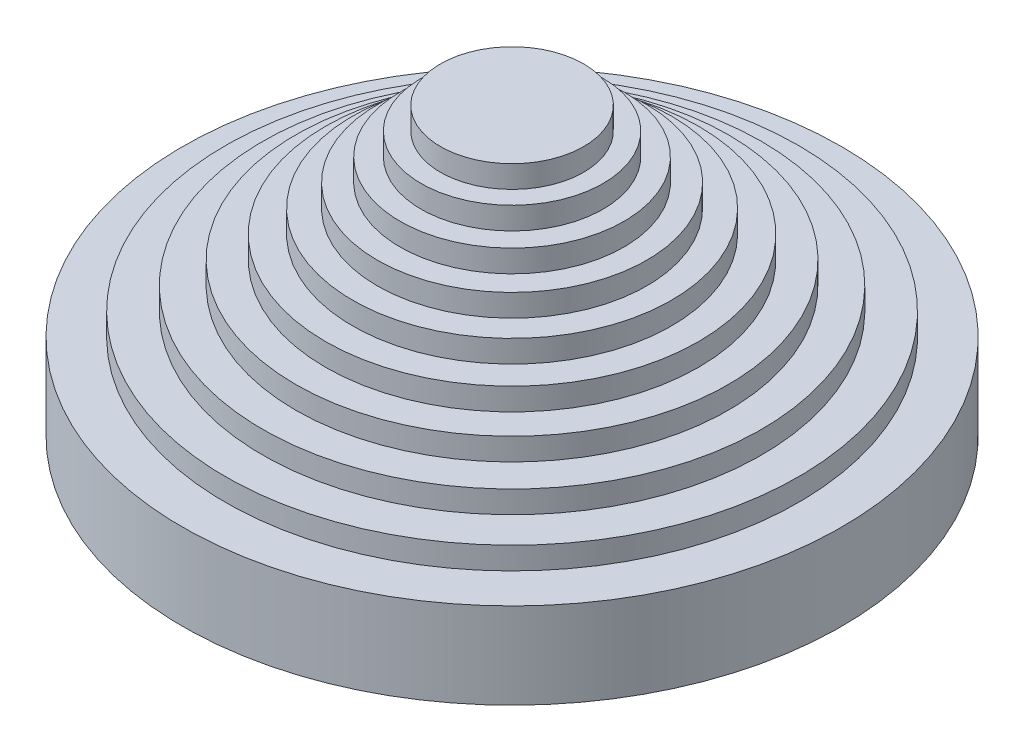
ISO-10303-21;
HEADER;
FILE_DESCRIPTION(('STEP AP214'),'2;1');
FILE_NAME('part.step','',(''),(''),'','','');
FILE_SCHEMA(('AUTOMOTIVE_DESIGN { 1 0 10303 214 1 1 1 1 }'));
ENDSEC;
DATA;
#1=APPLICATION_CONTEXT('core data for automotive mechanical design processes');
#2=APPLICATION_PROTOCOL_DEFINITION('international standard','automotive_design',2000,#1);
#3=PRODUCT_CONTEXT('',#1,'mechanical');
#4=PRODUCT('Part','Part','',(#3));
#5=PRODUCT_RELATED_PRODUCT_CATEGORY('part','',(#4));
#6=PRODUCT_DEFINITION_FORMATION('','',#4);
#7=PRODUCT_DEFINITION_CONTEXT('part definition',#1,'design');
#8=PRODUCT_DEFINITION('design','',#6,#7);
#9=PRODUCT_DEFINITION_SHAPE('','',#8);
#10=(LENGTH_UNIT() NAMED_UNIT(*) SI_UNIT(.MILLI.,.METRE.));
#11=(NAMED_UNIT(*) PLANE_ANGLE_UNIT() SI_UNIT($,.RADIAN.));
#12=(NAMED_UNIT(*) SI_UNIT($,.STERADIAN.) SOLID_ANGLE_UNIT());
#13=UNCERTAINTY_MEASURE_WITH_UNIT(LENGTH_MEASURE(1.E-05),#10,'distance_accuracy_value','');
#14=(GEOMETRIC_REPRESENTATION_CONTEXT(3) GLOBAL_UNCERTAINTY_ASSIGNED_CONTEXT((#13)) GLOBAL_UNIT_ASSIGNED_CONTEXT((#10,
#11,#12)) REPRESENTATION_CONTEXT('',''));
#15=CARTESIAN_POINT('',(0.,0.,0.));
#16=DIRECTION('',(0.,0.,1.));
#17=DIRECTION('',(1.,0.,0.));
#18=AXIS2_PLACEMENT_3D('',#15,#16,#17);
#19=CARTESIAN_POINT('',(0.,0.,11.5));
#20=DIRECTION('',(0.,1.,0.));
#21=DIRECTION('',(0.,0.,1.));
#22=AXIS2_PLACEMENT_3D('',#19,#20,#21);
#23=PLANE('',#22);
#24=CARTESIAN_POINT('',(0.,0.,0.));
#25=DIRECTION('',(0.,-1.,0.));
#26=DIRECTION('',(0.,0.,-1.));
#27=AXIS2_PLACEMENT_3D('',#24,#25,#26);
#28=CIRCLE('',#27,3.2);
#29=CARTESIAN_POINT('',(0.,0.,-3.2));
#30=VERTEX_POINT('',#29);
#31=EDGE_CURVE('E75',#30,#30,#28,.T.);
#32=ORIENTED_EDGE('',*,*,#31,.F.);
#33=EDGE_LOOP('',(#32));
#34=FACE_BOUND('',#33,.T.);
#35=CARTESIAN_POINT('',(0.,0.,0.));
#36=DIRECTION('',(0.,-1.,0.));
#37=DIRECTION('',(0.,0.,-1.));
#38=AXIS2_PLACEMENT_3D('',#35,#36,#37);
#39=CIRCLE('',#38,11.5);
#40=CARTESIAN_POINT('',(0.,0.,-11.5));
#41=VERTEX_POINT('',#40);
#42=EDGE_CURVE('E78',#41,#41,#39,.T.);
#43=ORIENTED_EDGE('',*,*,#42,.T.);
#44=EDGE_LOOP('',(#43));
#45=FACE_BOUND('',#44,.T.);
#46=ADVANCED_FACE('F32',(#34,#45),#23,.F.);
#47=CARTESIAN_POINT('',(0.,0.,0.));
#48=DIRECTION('',(0.,-1.,0.));
#49=DIRECTION('',(0.,0.,-1.));
#50=AXIS2_PLACEMENT_3D('',#47,#48,#49);
#51=CYLINDRICAL_SURFACE('',#50,11.5);
#52=ORIENTED_EDGE('',*,*,#42,.F.);
#53=EDGE_LOOP('',(#52));
#54=FACE_BOUND('',#53,.T.);
#55=CARTESIAN_POINT('',(0.,3.,0.));
#56=DIRECTION('',(0.,-1.,0.));
#57=DIRECTION('',(0.,0.,-1.));
#58=AXIS2_PLACEMENT_3D('',#55,#56,#57);
#59=CIRCLE('',#58,11.5);
#60=CARTESIAN_POINT('',(0.,3.,-11.5));
#61=VERTEX_POINT('',#60);
#62=EDGE_CURVE('E132',#61,#61,#59,.T.);
#63=ORIENTED_EDGE('',*,*,#62,.T.);
#64=EDGE_LOOP('',(#63));
#65=FACE_BOUND('',#64,.T.);
#66=ADVANCED_FACE('F152',(#54,#65),#51,.T.);
#67=CARTESIAN_POINT('',(0.,3.,11.5));
#68=DIRECTION('',(0.,-1.,0.));
#69=DIRECTION('',(0.,0.,-1.));
#70=AXIS2_PLACEMENT_3D('',#67,#68,#69);
#71=PLANE('',#70);
#72=ORIENTED_EDGE('',*,*,#62,.F.);
#73=EDGE_LOOP('',(#72));
#74=FACE_BOUND('',#73,.T.);
#75=CARTESIAN_POINT('',(0.,3.,0.));
#76=DIRECTION('',(0.,-1.,0.));
#77=DIRECTION('',(0.,0.,-1.));
#78=AXIS2_PLACEMENT_3D('',#75,#76,#77);
#79=CIRCLE('',#78,10.0042868103528);
#80=CARTESIAN_POINT('',(0.,3.,-10.0042868103528));
#81=VERTEX_POINT('',#80);
#82=EDGE_CURVE('E129',#81,#81,#79,.T.);
#83=ORIENTED_EDGE('',*,*,#82,.T.);
#84=EDGE_LOOP('',(#83));
#85=FACE_BOUND('',#84,.T.);
#86=ADVANCED_FACE('F157',(#74,#85),#71,.F.);
#87=CARTESIAN_POINT('',(0.,0.,0.));
#88=DIRECTION('',(0.,-1.,0.));
#89=DIRECTION('',(0.,0.,-1.));
#90=AXIS2_PLACEMENT_3D('',#87,#88,#89);
#91=CYLINDRICAL_SURFACE('',#90,10.0042868103528);
#92=ORIENTED_EDGE('',*,*,#82,.F.);
#93=EDGE_LOOP('',(#92));
#94=FACE_BOUND('',#93,.T.);
#95=CARTESIAN_POINT('',(0.,3.77777777777778,0.));
#96=DIRECTION('',(0.,-1.,0.));
#97=DIRECTION('',(0.,0.,-1.));
#98=AXIS2_PLACEMENT_3D('',#95,#96,#97);
#99=CIRCLE('',#98,10.0042868103528);
#100=CARTESIAN_POINT('',(0.,3.77777777777778,-10.0042868103528));
#101=VERTEX_POINT('',#100);
#102=EDGE_CURVE('E126',#101,#101,#99,.T.);
#103=ORIENTED_EDGE('',*,*,#102,.T.);
#104=EDGE_LOOP('',(#103));
#105=FACE_BOUND('',#104,.T.);
#106=ADVANCED_FACE('F162',(#94,#105),#91,.T.);
#107=CARTESIAN_POINT('',(0.,3.77777777777778,10.0042868103528));
#108=DIRECTION('',(0.,-1.,0.));
#109=DIRECTION('',(0.,0.,-1.));
#110=AXIS2_PLACEMENT_3D('',#107,#108,#109);
#111=PLANE('',#110);
#112=ORIENTED_EDGE('',*,*,#102,.F.);
#113=EDGE_LOOP('',(#112));
#114=FACE_BOUND('',#113,.T.);
#115=CARTESIAN_POINT('',(0.,3.77777777777778,0.));
#116=DIRECTION('',(0.,-1.,0.));
#117=DIRECTION('',(0.,0.,-1.));
#118=AXIS2_PLACEMENT_3D('',#115,#116,#117);
#119=CIRCLE('',#118,8.70328101729719);
#120=CARTESIAN_POINT('',(0.,3.77777777777778,-8.70328101729719));
#121=VERTEX_POINT('',#120);
#122=EDGE_CURVE('E123',#121,#121,#119,.T.);
#123=ORIENTED_EDGE('',*,*,#122,.T.);
#124=EDGE_LOOP('',(#123));
#125=FACE_BOUND('',#124,.T.);
#126=ADVANCED_FACE('F168',(#114,#125),#111,.F.);
#127=CARTESIAN_POINT('',(0.,0.,0.));
#128=DIRECTION('',(0.,-1.,0.));
#129=DIRECTION('',(0.,0.,-1.));
#130=AXIS2_PLACEMENT_3D('',#127,#128,#129);
#131=CYLINDRICAL_SURFACE('',#130,8.70328101729719);
#132=ORIENTED_EDGE('',*,*,#122,.F.);
#133=EDGE_LOOP('',(#132));
#134=FACE_BOUND('',#133,.T.);
#135=CARTESIAN_POINT('',(0.,4.55555555555555,0.));
#136=DIRECTION('',(0.,-1.,0.));
#137=DIRECTION('',(0.,0.,-1.));
#138=AXIS2_PLACEMENT_3D('',#135,#136,#137);
#139=CIRCLE('',#138,8.70328101729719);
#140=CARTESIAN_POINT('',(0.,4.55555555555555,-8.70328101729719));
#141=VERTEX_POINT('',#140);
#142=EDGE_CURVE('E120',#141,#141,#139,.T.);
#143=ORIENTED_EDGE('',*,*,#142,.T.);
#144=EDGE_LOOP('',(#143));
#145=FACE_BOUND('',#144,.T.);
#146=ADVANCED_FACE('F174',(#134,#145),#131,.T.);
#147=CARTESIAN_POINT('',(0.,4.55555555555556,8.70328101729719));
#148=DIRECTION('',(0.,-1.,0.));
#149=DIRECTION('',(0.,0.,-1.));
#150=AXIS2_PLACEMENT_3D('',#147,#148,#149);
#151=PLANE('',#150);
#152=ORIENTED_EDGE('',*,*,#142,.F.);
#153=EDGE_LOOP('',(#152));
#154=FACE_BOUND('',#153,.T.);
#155=CARTESIAN_POINT('',(0.,4.55555555555556,0.));
#156=DIRECTION('',(0.,-1.,0.));
#157=DIRECTION('',(0.,0.,-1.));
#158=AXIS2_PLACEMENT_3D('',#155,#156,#157);
#159=CIRCLE('',#158,7.548361645505);
#160=CARTESIAN_POINT('',(0.,4.55555555555556,-7.548361645505));
#161=VERTEX_POINT('',#160);
#162=EDGE_CURVE('E117',#161,#161,#159,.T.);
#163=ORIENTED_EDGE('',*,*,#162,.T.);
#164=EDGE_LOOP('',(#163));
#165=FACE_BOUND('',#164,.T.);
#166=ADVANCED_FACE('F180',(#154,#165),#151,.F.);
#167=CARTESIAN_POINT('',(0.,0.,0.));
#168=DIRECTION('',(0.,-1.,0.));
#169=DIRECTION('',(0.,0.,-1.));
#170=AXIS2_PLACEMENT_3D('',#167,#168,#169);
#171=CYLINDRICAL_SURFACE('',#170,7.548361645505);
#172=ORIENTED_EDGE('',*,*,#162,.F.);
#173=EDGE_LOOP('',(#172));
#174=FACE_BOUND('',#173,.T.);
#175=CARTESIAN_POINT('',(0.,5.33333333333334,0.));
#176=DIRECTION('',(0.,-1.,0.));
#177=DIRECTION('',(0.,0.,-1.));
#178=AXIS2_PLACEMENT_3D('',#175,#176,#177);
#179=CIRCLE('',#178,7.548361645505);
#180=CARTESIAN_POINT('',(0.,5.33333333333334,-7.548361645505));
#181=VERTEX_POINT('',#180);
#182=EDGE_CURVE('E114',#181,#181,#179,.T.);
#183=ORIENTED_EDGE('',*,*,#182,.T.);
#184=EDGE_LOOP('',(#183));
#185=FACE_BOUND('',#184,.T.);
#186=ADVANCED_FACE('F186',(#174,#185),#171,.T.);
#187=CARTESIAN_POINT('',(0.,5.33333333333333,7.548361645505));
#188=DIRECTION('',(0.,-1.,0.));
#189=DIRECTION('',(0.,0.,-1.));
#190=AXIS2_PLACEMENT_3D('',#187,#188,#189);
#191=PLANE('',#190);
#192=ORIENTED_EDGE('',*,*,#182,.F.);
#193=EDGE_LOOP('',(#192));
#194=FACE_BOUND('',#193,.T.);
#195=CARTESIAN_POINT('',(0.,5.33333333333333,0.));
#196=DIRECTION('',(0.,-1.,0.));
#197=DIRECTION('',(0.,0.,-1.));
#198=AXIS2_PLACEMENT_3D('',#195,#196,#197);
#199=CIRCLE('',#198,6.50918068187569);
#200=CARTESIAN_POINT('',(0.,5.33333333333333,-6.50918068187569));
#201=VERTEX_POINT('',#200);
#202=EDGE_CURVE('E111',#201,#201,#199,.T.);
#203=ORIENTED_EDGE('',*,*,#202,.T.);
#204=EDGE_LOOP('',(#203));
#205=FACE_BOUND('',#204,.T.);
#206=ADVANCED_FACE('F192',(#194,#205),#191,.F.);
#207=CARTESIAN_POINT('',(0.,0.,0.));
#208=DIRECTION('',(0.,-1.,0.));
#209=DIRECTION('',(0.,0.,-1.));
#210=AXIS2_PLACEMENT_3D('',#207,#208,#209);
#211=CYLINDRICAL_SURFACE('',#210,6.50918068187569);
#212=ORIENTED_EDGE('',*,*,#202,.F.);
#213=EDGE_LOOP('',(#212));
#214=FACE_BOUND('',#213,.T.);
#215=CARTESIAN_POINT('',(0.,6.11111111111111,0.));
#216=DIRECTION('',(0.,-1.,0.));
#217=DIRECTION('',(0.,0.,-1.));
#218=AXIS2_PLACEMENT_3D('',#215,#216,#217);
#219=CIRCLE('',#218,6.50918068187569);
#220=CARTESIAN_POINT('',(0.,6.11111111111111,-6.50918068187569));
#221=VERTEX_POINT('',#220);
#222=EDGE_CURVE('E108',#221,#221,#219,.T.);
#223=ORIENTED_EDGE('',*,*,#222,.T.);
#224=EDGE_LOOP('',(#223));
#225=FACE_BOUND('',#224,.T.);
#226=ADVANCED_FACE('F198',(#214,#225),#211,.T.);
#227=CARTESIAN_POINT('',(0.,6.11111111111111,6.50918068187569));
#228=DIRECTION('',(0.,-1.,0.));
#229=DIRECTION('',(0.,0.,-1.));
#230=AXIS2_PLACEMENT_3D('',#227,#228,#229);
#231=PLANE('',#230);
#232=ORIENTED_EDGE('',*,*,#222,.F.);
#233=EDGE_LOOP('',(#232));
#234=FACE_BOUND('',#233,.T.);
#235=CARTESIAN_POINT('',(0.,6.11111111111111,0.));
#236=DIRECTION('',(0.,-1.,0.));
#237=DIRECTION('',(0.,0.,-1.));
#238=AXIS2_PLACEMENT_3D('',#235,#236,#237);
#239=CIRCLE('',#238,5.56526863170023);
#240=CARTESIAN_POINT('',(0.,6.11111111111111,-5.56526863170023));
#241=VERTEX_POINT('',#240);
#242=EDGE_CURVE('E105',#241,#241,#239,.T.);
#243=ORIENTED_EDGE('',*,*,#242,.T.);
#244=EDGE_LOOP('',(#243));
#245=FACE_BOUND('',#244,.T.);
#246=ADVANCED_FACE('F204',(#234,#245),#231,.F.);
#247=CARTESIAN_POINT('',(0.,0.,0.));
#248=DIRECTION('',(0.,-1.,0.));
#249=DIRECTION('',(0.,0.,-1.));
#250=AXIS2_PLACEMENT_3D('',#247,#248,#249);
#251=CYLINDRICAL_SURFACE('',#250,5.56526863170023);
#252=ORIENTED_EDGE('',*,*,#242,.F.);
#253=EDGE_LOOP('',(#252));
#254=FACE_BOUND('',#253,.T.);
#255=CARTESIAN_POINT('',(0.,6.88888888888889,0.));
#256=DIRECTION('',(0.,-1.,0.));
#257=DIRECTION('',(0.,0.,-1.));
#258=AXIS2_PLACEMENT_3D('',#255,#256,#257);
#259=CIRCLE('',#258,5.56526863170023);
#260=CARTESIAN_POINT('',(0.,6.88888888888889,-5.56526863170023));
#261=VERTEX_POINT('',#260);
#262=EDGE_CURVE('E102',#261,#261,#259,.T.);
#263=ORIENTED_EDGE('',*,*,#262,.T.);
#264=EDGE_LOOP('',(#263));
#265=FACE_BOUND('',#264,.T.);
#266=ADVANCED_FACE('F210',(#254,#265),#251,.T.);
#267=CARTESIAN_POINT('',(0.,6.88888888888889,5.56526863170023));
#268=DIRECTION('',(0.,-1.,0.));
#269=DIRECTION('',(0.,0.,-1.));
#270=AXIS2_PLACEMENT_3D('',#267,#268,#269);
#271=PLANE('',#270);
#272=ORIENTED_EDGE('',*,*,#262,.F.);
#273=EDGE_LOOP('',(#272));
#274=FACE_BOUND('',#273,.T.);
#275=CARTESIAN_POINT('',(0.,6.88888888888889,0.));
#276=DIRECTION('',(0.,-1.,0.));
#277=DIRECTION('',(0.,0.,-1.));
#278=AXIS2_PLACEMENT_3D('',#275,#276,#277);
#279=CIRCLE('',#278,4.70203774251105);
#280=CARTESIAN_POINT('',(0.,6.88888888888889,-4.70203774251105));
#281=VERTEX_POINT('',#280);
#282=EDGE_CURVE('E99',#281,#281,#279,.T.);
#283=ORIENTED_EDGE('',*,*,#282,.T.);
#284=EDGE_LOOP('',(#283));
#285=FACE_BOUND('',#284,.T.);
#286=ADVANCED_FACE('F216',(#274,#285),#271,.F.);
#287=CARTESIAN_POINT('',(0.,0.,0.));
#288=DIRECTION('',(0.,-1.,0.));
#289=DIRECTION('',(0.,0.,-1.));
#290=AXIS2_PLACEMENT_3D('',#287,#288,#289);
#291=CYLINDRICAL_SURFACE('',#290,4.70203774251105);
#292=ORIENTED_EDGE('',*,*,#282,.F.);
#293=EDGE_LOOP('',(#292));
#294=FACE_BOUND('',#293,.T.);
#295=CARTESIAN_POINT('',(0.,7.66666666666667,0.));
#296=DIRECTION('',(0.,-1.,0.));
#297=DIRECTION('',(0.,0.,-1.));
#298=AXIS2_PLACEMENT_3D('',#295,#296,#297);
#299=CIRCLE('',#298,4.70203774251105);
#300=CARTESIAN_POINT('',(0.,7.66666666666667,-4.70203774251105));
#301=VERTEX_POINT('',#300);
#302=EDGE_CURVE('E96',#301,#301,#299,.T.);
#303=ORIENTED_EDGE('',*,*,#302,.T.);
#304=EDGE_LOOP('',(#303));
#305=FACE_BOUND('',#304,.T.);
#306=ADVANCED_FACE('F222',(#294,#305),#291,.T.);
#307=CARTESIAN_POINT('',(0.,7.66666666666667,4.70203774251105));
#308=DIRECTION('',(0.,-1.,0.));
#309=DIRECTION('',(0.,0.,-1.));
#310=AXIS2_PLACEMENT_3D('',#307,#308,#309);
#311=PLANE('',#310);
#312=ORIENTED_EDGE('',*,*,#302,.F.);
#313=EDGE_LOOP('',(#312));
#314=FACE_BOUND('',#313,.T.);
#315=CARTESIAN_POINT('',(0.,7.66666666666667,0.));
#316=DIRECTION('',(0.,-1.,0.));
#317=DIRECTION('',(0.,0.,-1.));
#318=AXIS2_PLACEMENT_3D('',#315,#316,#317);
#319=CIRCLE('',#318,3.90865574576532);
#320=CARTESIAN_POINT('',(0.,7.66666666666667,-3.90865574576532));
#321=VERTEX_POINT('',#320);
#322=EDGE_CURVE('E93',#321,#321,#319,.T.);
#323=ORIENTED_EDGE('',*,*,#322,.T.);
#324=EDGE_LOOP('',(#323));
#325=FACE_BOUND('',#324,.T.);
#326=ADVANCED_FACE('F228',(#314,#325),#311,.F.);
#327=CARTESIAN_POINT('',(0.,0.,0.));
#328=DIRECTION('',(0.,-1.,0.));
#329=DIRECTION('',(0.,0.,-1.));
#330=AXIS2_PLACEMENT_3D('',#327,#328,#329);
#331=CYLINDRICAL_SURFACE('',#330,3.90865574576532);
#332=ORIENTED_EDGE('',*,*,#322,.F.);
#333=EDGE_LOOP('',(#332));
#334=FACE_BOUND('',#333,.T.);
#335=CARTESIAN_POINT('',(0.,8.44444444444444,0.));
#336=DIRECTION('',(0.,-1.,0.));
#337=DIRECTION('',(0.,0.,-1.));
#338=AXIS2_PLACEMENT_3D('',#335,#336,#337);
#339=CIRCLE('',#338,3.90865574576532);
#340=CARTESIAN_POINT('',(0.,8.44444444444444,-3.90865574576532));
#341=VERTEX_POINT('',#340);
#342=EDGE_CURVE('E90',#341,#341,#339,.T.);
#343=ORIENTED_EDGE('',*,*,#342,.T.);
#344=EDGE_LOOP('',(#343));
#345=FACE_BOUND('',#344,.T.);
#346=ADVANCED_FACE('F234',(#334,#345),#331,.T.);
#347=CARTESIAN_POINT('',(0.,8.44444444444445,3.90865574576532));
#348=DIRECTION('',(0.,-1.,0.));
#349=DIRECTION('',(0.,0.,-1.));
#350=AXIS2_PLACEMENT_3D('',#347,#348,#349);
#351=PLANE('',#350);
#352=ORIENTED_EDGE('',*,*,#342,.F.);
#353=EDGE_LOOP('',(#352));
#354=FACE_BOUND('',#353,.T.);
#355=CARTESIAN_POINT('',(0.,8.44444444444445,0.));
#356=DIRECTION('',(0.,-1.,0.));
#357=DIRECTION('',(0.,0.,-1.));
#358=AXIS2_PLACEMENT_3D('',#355,#356,#357);
#359=CIRCLE('',#358,3.17681912757138);
#360=CARTESIAN_POINT('',(0.,8.44444444444445,-3.17681912757138));
#361=VERTEX_POINT('',#360);
#362=EDGE_CURVE('E87',#361,#361,#359,.T.);
#363=ORIENTED_EDGE('',*,*,#362,.T.);
#364=EDGE_LOOP('',(#363));
#365=FACE_BOUND('',#364,.T.);
#366=ADVANCED_FACE('F240',(#354,#365),#351,.F.);
#367=CARTESIAN_POINT('',(0.,0.,0.));
#368=DIRECTION('',(0.,-1.,0.));
#369=DIRECTION('',(0.,0.,-1.));
#370=AXIS2_PLACEMENT_3D('',#367,#368,#369);
#371=CYLINDRICAL_SURFACE('',#370,3.17681912757138);
#372=ORIENTED_EDGE('',*,*,#362,.F.);
#373=EDGE_LOOP('',(#372));
#374=FACE_BOUND('',#373,.T.);
#375=CARTESIAN_POINT('',(0.,9.22222222222223,0.));
#376=DIRECTION('',(0.,-1.,0.));
#377=DIRECTION('',(0.,0.,-1.));
#378=AXIS2_PLACEMENT_3D('',#375,#376,#377);
#379=CIRCLE('',#378,3.17681912757138);
#380=CARTESIAN_POINT('',(0.,9.22222222222223,-3.17681912757138));
#381=VERTEX_POINT('',#380);
#382=EDGE_CURVE('E84',#381,#381,#379,.T.);
#383=ORIENTED_EDGE('',*,*,#382,.T.);
#384=EDGE_LOOP('',(#383));
#385=FACE_BOUND('',#384,.T.);
#386=ADVANCED_FACE('F246',(#374,#385),#371,.T.);
#387=CARTESIAN_POINT('',(0.,9.22222222222222,3.17681912757138));
#388=DIRECTION('',(0.,-1.,0.));
#389=DIRECTION('',(0.,0.,-1.));
#390=AXIS2_PLACEMENT_3D('',#387,#388,#389);
#391=PLANE('',#390);
#392=ORIENTED_EDGE('',*,*,#382,.F.);
#393=EDGE_LOOP('',(#392));
#394=FACE_BOUND('',#393,.T.);
#395=CARTESIAN_POINT('',(0.,9.22222222222222,0.));
#396=DIRECTION('',(0.,-1.,0.));
#397=DIRECTION('',(0.,0.,-1.));
#398=AXIS2_PLACEMENT_3D('',#395,#396,#397);
#399=CIRCLE('',#398,2.50000000000001);
#400=CARTESIAN_POINT('',(0.,9.22222222222222,-2.50000000000001));
#401=VERTEX_POINT('',#400);
#402=EDGE_CURVE('E81',#401,#401,#399,.T.);
#403=ORIENTED_EDGE('',*,*,#402,.T.);
#404=EDGE_LOOP('',(#403));
#405=FACE_BOUND('',#404,.T.);
#406=ADVANCED_FACE('F252',(#394,#405),#391,.F.);
#407=CARTESIAN_POINT('',(0.,0.,0.));
#408=DIRECTION('',(0.,-1.,0.));
#409=DIRECTION('',(0.,0.,-1.));
#410=AXIS2_PLACEMENT_3D('',#407,#408,#409);
#411=CYLINDRICAL_SURFACE('',#410,2.50000000000001);
#412=ORIENTED_EDGE('',*,*,#402,.F.);
#413=EDGE_LOOP('',(#412));
#414=FACE_BOUND('',#413,.T.);
#415=CARTESIAN_POINT('',(0.,10.,0.));
#416=DIRECTION('',(0.,-1.,0.));
#417=DIRECTION('',(0.,0.,-1.));
#418=AXIS2_PLACEMENT_3D('',#415,#416,#417);
#419=CIRCLE('',#418,2.50000000000001);
#420=CARTESIAN_POINT('',(0.,10.,-2.50000000000001));
#421=VERTEX_POINT('',#420);
#422=EDGE_CURVE('E74',#421,#421,#419,.T.);
#423=ORIENTED_EDGE('',*,*,#422,.T.);
#424=EDGE_LOOP('',(#423));
#425=FACE_BOUND('',#424,.T.);
#426=ADVANCED_FACE('F258',(#414,#425),#411,.T.);
#427=CARTESIAN_POINT('',(0.,10.,2.50000000000001));
#428=DIRECTION('',(0.,-1.,0.));
#429=DIRECTION('',(0.,0.,-1.));
#430=AXIS2_PLACEMENT_3D('',#427,#428,#429);
#431=PLANE('',#430);
#432=ORIENTED_EDGE('',*,*,#422,.F.);
#433=EDGE_LOOP('',(#432));
#434=FACE_BOUND('',#433,.T.);
#435=ADVANCED_FACE('F146',(#434),#431,.F.);
#436=CARTESIAN_POINT('',(0.,-2.6,0.));
#437=DIRECTION('',(0.,1.,0.));
#438=DIRECTION('',(0.,0.,1.));
#439=AXIS2_PLACEMENT_3D('',#436,#437,#438);
#440=CYLINDRICAL_SURFACE('',#439,3.2);
#441=CARTESIAN_POINT('',(0.,-2.6,0.));
#442=DIRECTION('',(0.,-1.,0.));
#443=DIRECTION('',(0.,0.,-1.));
#444=AXIS2_PLACEMENT_3D('',#441,#442,#443);
#445=CIRCLE('',#444,3.2);
#446=CARTESIAN_POINT('',(0.,-2.6,-3.2));
#447=VERTEX_POINT('',#446);
#448=EDGE_CURVE('E70',#447,#447,#445,.T.);
#449=ORIENTED_EDGE('',*,*,#448,.F.);
#450=EDGE_LOOP('',(#449));
#451=FACE_BOUND('',#450,.T.);
#452=ORIENTED_EDGE('',*,*,#31,.T.);
#453=EDGE_LOOP('',(#452));
#454=FACE_BOUND('',#453,.T.);
#455=ADVANCED_FACE('F140',(#451,#454),#440,.T.);
#456=CARTESIAN_POINT('',(0.,-2.6,0.));
#457=DIRECTION('',(0.,-1.,0.));
#458=DIRECTION('',(0.,0.,-1.));
#459=AXIS2_PLACEMENT_3D('',#456,#457,#458);
#460=PLANE('',#459);
#461=CARTESIAN_POINT('',(0.,-2.6,0.));
#462=DIRECTION('',(0.,-1.,0.));
#463=DIRECTION('',(0.,0.,-1.));
#464=AXIS2_PLACEMENT_3D('',#461,#462,#463);
#465=CIRCLE('',#464,2.05);
#466=CARTESIAN_POINT('',(-1.44913767461894,-2.6,1.45));
#467=VERTEX_POINT('',#466);
#468=CARTESIAN_POINT('',(1.44913767461894,-2.6,1.45));
#469=VERTEX_POINT('',#468);
#470=EDGE_CURVE('E11',#467,#469,#465,.T.);
#471=ORIENTED_EDGE('',*,*,#470,.F.);
#472=DIRECTION('',(1.,0.,0.));
#473=VECTOR('',#472,1.);
#474=CARTESIAN_POINT('',(0.,-2.6,1.45));
#475=LINE('',#474,#473);
#476=EDGE_CURVE('E39',#467,#469,#475,.T.);
#477=ORIENTED_EDGE('',*,*,#476,.T.);
#478=EDGE_LOOP('',(#471,#477));
#479=FACE_BOUND('',#478,.T.);
#480=ORIENTED_EDGE('',*,*,#448,.T.);
#481=EDGE_LOOP('',(#480));
#482=FACE_BOUND('',#481,.T.);
#483=ADVANCED_FACE('F137',(#479,#482),#460,.T.);
#484=CARTESIAN_POINT('',(0.,3.,0.));
#485=DIRECTION('',(0.,-1.,0.));
#486=DIRECTION('',(0.,0.,-1.));
#487=AXIS2_PLACEMENT_3D('',#484,#485,#486);
#488=CYLINDRICAL_SURFACE('',#487,2.05);
#489=ORIENTED_EDGE('',*,*,#470,.T.);
#490=DIRECTION('',(0.,-1.,0.));
#491=VECTOR('',#490,1.);
#492=CARTESIAN_POINT('',(1.44913767461894,3.,1.45));
#493=LINE('',#492,#491);
#494=CARTESIAN_POINT('',(1.44913767461894,3.,1.45));
#495=VERTEX_POINT('',#494);
#496=EDGE_CURVE('E46',#495,#469,#493,.T.);
#497=ORIENTED_EDGE('',*,*,#496,.F.);
#498=CARTESIAN_POINT('',(0.,3.,0.));
#499=DIRECTION('',(0.,-1.,0.));
#500=DIRECTION('',(0.,0.,-1.));
#501=AXIS2_PLACEMENT_3D('',#498,#499,#500);
#502=CIRCLE('',#501,2.05);
#503=CARTESIAN_POINT('',(-1.44913767461894,3.,1.45));
#504=VERTEX_POINT('',#503);
#505=EDGE_CURVE('E61',#504,#495,#502,.T.);
#506=ORIENTED_EDGE('',*,*,#505,.F.);
#507=DIRECTION('',(0.,-1.,0.));
#508=VECTOR('',#507,1.);
#509=CARTESIAN_POINT('',(-1.44913767461894,3.,1.45));
#510=LINE('',#509,#508);
#511=EDGE_CURVE('E57',#504,#467,#510,.T.);
#512=ORIENTED_EDGE('',*,*,#511,.T.);
#513=EDGE_LOOP('',(#489,#497,#506,#512));
#514=FACE_BOUND('',#513,.T.);
#515=ADVANCED_FACE('F64',(#514),#488,.F.);
#516=CARTESIAN_POINT('',(-1.44913767461894,3.,1.45));
#517=DIRECTION('',(0.,0.,-1.));
#518=DIRECTION('',(-1.,0.,0.));
#519=AXIS2_PLACEMENT_3D('',#516,#517,#518);
#520=PLANE('',#519);
#521=ORIENTED_EDGE('',*,*,#511,.F.);
#522=DIRECTION('',(1.,0.,0.));
#523=VECTOR('',#522,1.);
#524=CARTESIAN_POINT('',(-1.44913767461894,3.,1.45));
#525=LINE('',#524,#523);
#526=EDGE_CURVE('E55',#504,#495,#525,.T.);
#527=ORIENTED_EDGE('',*,*,#526,.T.);
#528=ORIENTED_EDGE('',*,*,#496,.T.);
#529=ORIENTED_EDGE('',*,*,#476,.F.);
#530=EDGE_LOOP('',(#521,#527,#528,#529));
#531=FACE_BOUND('',#530,.T.);
#532=ADVANCED_FACE('F56',(#531),#520,.T.);
#533=CARTESIAN_POINT('',(0.,3.,0.));
#534=DIRECTION('',(0.,-1.,0.));
#535=DIRECTION('',(0.,0.,-1.));
#536=AXIS2_PLACEMENT_3D('',#533,#534,#535);
#537=PLANE('',#536);
#538=ORIENTED_EDGE('',*,*,#505,.T.);
#539=ORIENTED_EDGE('',*,*,#526,.F.);
#540=EDGE_LOOP('',(#538,#539));
#541=FACE_BOUND('',#540,.T.);
#542=ADVANCED_FACE('F67',(#541),#537,.T.);
#543=CLOSED_SHELL('',(#46,#66,#86,#106,#126,#146,#166,#186,#206,#226,#246,#266,#286,#306,#326,
#346,#366,#386,#406,#426,#435,#455,#483,#515,#532,#542));
#544=MANIFOLD_SOLID_BREP('B2',#543);
#545=ADVANCED_BREP_SHAPE_REPRESENTATION('',(#18,#544),#14);
#546=SHAPE_DEFINITION_REPRESENTATION(#9,#545);
ENDSEC;
END-ISO-10303-21;
